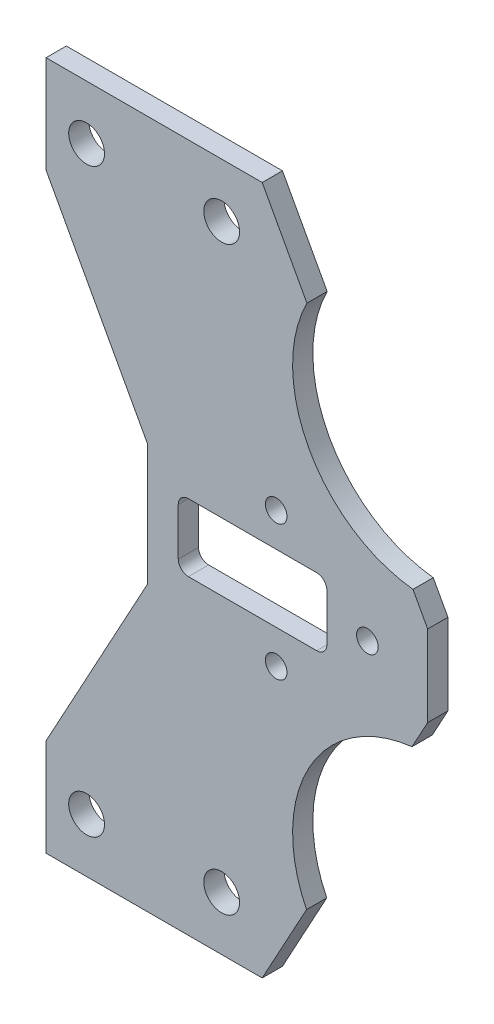
ISO-10303-21;
HEADER;
FILE_DESCRIPTION(('STEP AP214'),'2;1');
FILE_NAME('part.step','',(''),(''),'','','');
FILE_SCHEMA(('AUTOMOTIVE_DESIGN { 1 0 10303 214 1 1 1 1 }'));
ENDSEC;
DATA;
#1=APPLICATION_CONTEXT('core data for automotive mechanical design processes');
#2=APPLICATION_PROTOCOL_DEFINITION('international standard','automotive_design',2000,#1);
#3=PRODUCT_CONTEXT('',#1,'mechanical');
#4=PRODUCT('Part','Part','',(#3));
#5=PRODUCT_RELATED_PRODUCT_CATEGORY('part','',(#4));
#6=PRODUCT_DEFINITION_FORMATION('','',#4);
#7=PRODUCT_DEFINITION_CONTEXT('part definition',#1,'design');
#8=PRODUCT_DEFINITION('design','',#6,#7);
#9=PRODUCT_DEFINITION_SHAPE('','',#8);
#10=(LENGTH_UNIT() NAMED_UNIT(*) SI_UNIT(.MILLI.,.METRE.));
#11=(NAMED_UNIT(*) PLANE_ANGLE_UNIT() SI_UNIT($,.RADIAN.));
#12=(NAMED_UNIT(*) SI_UNIT($,.STERADIAN.) SOLID_ANGLE_UNIT());
#13=UNCERTAINTY_MEASURE_WITH_UNIT(LENGTH_MEASURE(1.E-05),#10,'distance_accuracy_value','');
#14=(GEOMETRIC_REPRESENTATION_CONTEXT(3) GLOBAL_UNCERTAINTY_ASSIGNED_CONTEXT((#13)) GLOBAL_UNIT_ASSIGNED_CONTEXT((#10,
#11,#12)) REPRESENTATION_CONTEXT('',''));
#15=CARTESIAN_POINT('',(0.,0.,0.));
#16=DIRECTION('',(0.,0.,1.));
#17=DIRECTION('',(1.,0.,0.));
#18=AXIS2_PLACEMENT_3D('',#15,#16,#17);
#19=CARTESIAN_POINT('',(-2.00000000001422,-49.7400000000227,3.));
#20=DIRECTION('',(-0.878270215756522,0.478164645404688,0.));
#21=DIRECTION('',(-0.478164645404688,-0.878270215756523,0.));
#22=AXIS2_PLACEMENT_3D('',#19,#20,#21);
#23=PLANE('',#22);
#24=DIRECTION('',(0.478164645404688,0.878270215756523,0.));
#25=VECTOR('',#24,1.);
#26=CARTESIAN_POINT('',(-2.00000000001422,-49.7400000000227,0.));
#27=LINE('',#26,#25);
#28=CARTESIAN_POINT('',(-2.00000000001422,-49.7400000000227,0.));
#29=VERTEX_POINT('',#28);
#30=CARTESIAN_POINT('',(4.55807759293036,-37.6944331061576,0.));
#31=VERTEX_POINT('',#30);
#32=EDGE_CURVE('E227',#29,#31,#27,.T.);
#33=ORIENTED_EDGE('',*,*,#32,.T.);
#34=DIRECTION('',(0.,0.,1.));
#35=VECTOR('',#34,1.);
#36=CARTESIAN_POINT('',(4.55807759293037,-37.6944331061576,0.));
#37=LINE('',#36,#35);
#38=CARTESIAN_POINT('',(4.55807759293036,-37.6944331061576,3.));
#39=VERTEX_POINT('',#38);
#40=EDGE_CURVE('E11',#31,#39,#37,.T.);
#41=ORIENTED_EDGE('',*,*,#40,.T.);
#42=DIRECTION('',(0.478164645404688,0.878270215756523,0.));
#43=VECTOR('',#42,1.);
#44=CARTESIAN_POINT('',(-2.00000000001422,-49.7400000000227,3.));
#45=LINE('',#44,#43);
#46=CARTESIAN_POINT('',(-2.00000000001422,-49.7400000000227,3.));
#47=VERTEX_POINT('',#46);
#48=EDGE_CURVE('E206',#47,#39,#45,.T.);
#49=ORIENTED_EDGE('',*,*,#48,.F.);
#50=DIRECTION('',(0.,0.,-1.));
#51=VECTOR('',#50,1.);
#52=CARTESIAN_POINT('',(-2.00000000001422,-49.7400000000227,3.));
#53=LINE('',#52,#51);
#54=EDGE_CURVE('E244',#47,#29,#53,.T.);
#55=ORIENTED_EDGE('',*,*,#54,.T.);
#56=EDGE_LOOP('',(#33,#41,#49,#55));
#57=FACE_BOUND('',#56,.T.);
#58=ADVANCED_FACE('F33',(#57),#23,.F.);
#59=CARTESIAN_POINT('',(22.5011205762868,7.26249999997726,3.));
#60=DIRECTION('',(-0.87827021575671,-0.478164645404344,0.));
#61=DIRECTION('',(0.478164645404344,-0.87827021575671,0.));
#62=AXIS2_PLACEMENT_3D('',#59,#60,#61);
#63=PLANE('',#62);
#64=DIRECTION('',(-0.478164645404344,0.87827021575671,0.));
#65=VECTOR('',#64,1.);
#66=CARTESIAN_POINT('',(22.5011205762868,7.26249999997726,0.));
#67=LINE('',#66,#65);
#68=CARTESIAN_POINT('',(22.5011205762868,7.26249999997726,0.));
#69=VERTEX_POINT('',#68);
#70=CARTESIAN_POINT('',(20.3254373282089,11.258692136039,0.));
#71=VERTEX_POINT('',#70);
#72=EDGE_CURVE('E233',#69,#71,#67,.T.);
#73=ORIENTED_EDGE('',*,*,#72,.T.);
#74=DIRECTION('',(0.,0.,1.));
#75=VECTOR('',#74,1.);
#76=CARTESIAN_POINT('',(20.3254373282089,11.258692136039,0.));
#77=LINE('',#76,#75);
#78=CARTESIAN_POINT('',(20.3254373282089,11.258692136039,3.));
#79=VERTEX_POINT('',#78);
#80=EDGE_CURVE('E187',#71,#79,#77,.T.);
#81=ORIENTED_EDGE('',*,*,#80,.T.);
#82=DIRECTION('',(-0.478164645404344,0.87827021575671,0.));
#83=VECTOR('',#82,1.);
#84=CARTESIAN_POINT('',(22.5011205762868,7.26249999997726,3.));
#85=LINE('',#84,#83);
#86=CARTESIAN_POINT('',(22.5011205762868,7.26249999997726,3.));
#87=VERTEX_POINT('',#86);
#88=EDGE_CURVE('E198',#87,#79,#85,.T.);
#89=ORIENTED_EDGE('',*,*,#88,.F.);
#90=DIRECTION('',(0.,0.,-1.));
#91=VECTOR('',#90,1.);
#92=CARTESIAN_POINT('',(22.5011205762868,7.26249999997726,3.));
#93=LINE('',#92,#91);
#94=EDGE_CURVE('E238',#87,#69,#93,.T.);
#95=ORIENTED_EDGE('',*,*,#94,.T.);
#96=EDGE_LOOP('',(#73,#81,#89,#95));
#97=FACE_BOUND('',#96,.T.);
#98=ADVANCED_FACE('F282',(#97),#63,.F.);
#99=CARTESIAN_POINT('',(0.,0.,3.));
#100=DIRECTION('',(0.,0.,1.));
#101=DIRECTION('',(1.,0.,0.));
#102=AXIS2_PLACEMENT_3D('',#99,#100,#101);
#103=PLANE('',#102);
#104=CARTESIAN_POINT('',(22.5011205816073,31.1399999999821,3.));
#105=DIRECTION('',(0.,0.,1.));
#106=DIRECTION('',(1.,0.,0.));
#107=AXIS2_PLACEMENT_3D('',#104,#105,#106);
#108=CIRCLE('',#107,20.);
#109=CARTESIAN_POINT('',(4.62172069778161,40.1025364598384,3.));
#110=VERTEX_POINT('',#109);
#111=EDGE_CURVE('E182',#110,#79,#108,.T.);
#112=ORIENTED_EDGE('',*,*,#111,.F.);
#113=CARTESIAN_POINT('',(-1.99999999999215,52.2649999999787,3.));
#114=VERTEX_POINT('',#113);
#115=EDGE_CURVE('E195',#110,#114,#85,.T.);
#116=ORIENTED_EDGE('',*,*,#115,.T.);
#117=DIRECTION('',(-1.,0.,0.));
#118=VECTOR('',#117,1.);
#119=CARTESIAN_POINT('',(-1.99999999999215,52.2649999999787,3.));
#120=LINE('',#119,#118);
#121=CARTESIAN_POINT('',(-33.9999998897314,52.2649999999788,3.));
#122=VERTEX_POINT('',#121);
#123=EDGE_CURVE('E236',#114,#122,#120,.T.);
#124=ORIENTED_EDGE('',*,*,#123,.T.);
#125=DIRECTION('',(0.,-1.,0.));
#126=VECTOR('',#125,1.);
#127=CARTESIAN_POINT('',(-33.9999998897314,52.2649999999788,3.));
#128=LINE('',#127,#126);
#129=CARTESIAN_POINT('',(-33.9999998897314,37.8445419864148,3.));
#130=VERTEX_POINT('',#129);
#131=EDGE_CURVE('E390',#122,#130,#128,.T.);
#132=ORIENTED_EDGE('',*,*,#131,.T.);
#133=DIRECTION('',(0.478164645404344,-0.87827021575671,0.));
#134=VECTOR('',#133,1.);
#135=CARTESIAN_POINT('',(-33.9999998897314,37.8445419864148,3.));
#136=LINE('',#135,#134);
#137=CARTESIAN_POINT('',(-18.9999998897314,10.2932511016393,3.));
#138=VERTEX_POINT('',#137);
#139=EDGE_CURVE('E392',#130,#138,#136,.T.);
#140=ORIENTED_EDGE('',*,*,#139,.T.);
#141=DIRECTION('',(0.,-1.,0.));
#142=VECTOR('',#141,1.);
#143=CARTESIAN_POINT('',(-18.9999998897314,10.2932511016393,3.));
#144=LINE('',#143,#142);
#145=CARTESIAN_POINT('',(-18.9999998897314,-7.76825110166631,3.));
#146=VERTEX_POINT('',#145);
#147=EDGE_CURVE('E394',#138,#146,#144,.T.);
#148=ORIENTED_EDGE('',*,*,#147,.T.);
#149=DIRECTION('',(-0.478164645404688,-0.878270215756523,0.));
#150=VECTOR('',#149,1.);
#151=CARTESIAN_POINT('',(-18.9999998897314,-7.76825110166631,3.));
#152=LINE('',#151,#150);
#153=CARTESIAN_POINT('',(-33.9999998897314,-35.3195419864162,3.));
#154=VERTEX_POINT('',#153);
#155=EDGE_CURVE('E396',#146,#154,#152,.T.);
#156=ORIENTED_EDGE('',*,*,#155,.T.);
#157=DIRECTION('',(-1.53160872389053E-12,-1.,0.));
#158=VECTOR('',#157,1.);
#159=CARTESIAN_POINT('',(-33.9999998897314,-35.3195419864162,3.));
#160=LINE('',#159,#158);
#161=CARTESIAN_POINT('',(-33.9999998897535,-49.7400000000226,3.));
#162=VERTEX_POINT('',#161);
#163=EDGE_CURVE('E398',#154,#162,#160,.T.);
#164=ORIENTED_EDGE('',*,*,#163,.T.);
#165=DIRECTION('',(1.,0.,0.));
#166=VECTOR('',#165,1.);
#167=CARTESIAN_POINT('',(-33.9999998897535,-49.7400000000226,3.));
#168=LINE('',#167,#166);
#169=EDGE_CURVE('E400',#162,#47,#168,.T.);
#170=ORIENTED_EDGE('',*,*,#169,.T.);
#171=ORIENTED_EDGE('',*,*,#48,.T.);
#172=CARTESIAN_POINT('',(22.5011205816028,-28.8600000000295,3.));
#173=DIRECTION('',(0.,0.,1.));
#174=DIRECTION('',(1.,0.,0.));
#175=AXIS2_PLACEMENT_3D('',#172,#173,#174);
#176=CIRCLE('',#175,20.);
#177=CARTESIAN_POINT('',(20.1833011275658,-8.99476119002556,3.));
#178=VERTEX_POINT('',#177);
#179=EDGE_CURVE('E291',#178,#39,#176,.T.);
#180=ORIENTED_EDGE('',*,*,#179,.F.);
#181=CARTESIAN_POINT('',(22.5011205762868,-4.73750000002275,3.));
#182=VERTEX_POINT('',#181);
#183=EDGE_CURVE('E269',#178,#182,#45,.T.);
#184=ORIENTED_EDGE('',*,*,#183,.T.);
#185=DIRECTION('',(0.,1.,0.));
#186=VECTOR('',#185,1.);
#187=CARTESIAN_POINT('',(22.5011205762868,-4.73750000002275,3.));
#188=LINE('',#187,#186);
#189=EDGE_CURVE('E204',#182,#87,#188,.T.);
#190=ORIENTED_EDGE('',*,*,#189,.T.);
#191=ORIENTED_EDGE('',*,*,#88,.T.);
#192=EDGE_LOOP('',(#112,#116,#124,#132,#140,#148,#156,#164,#170,#171,#180,#184,#190,#191));
#193=FACE_BOUND('',#192,.T.);
#194=CARTESIAN_POINT('',(13.5711205815829,1.26249999997724,3.));
#195=DIRECTION('',(0.,0.,1.));
#196=DIRECTION('',(1.,0.,0.));
#197=AXIS2_PLACEMENT_3D('',#194,#195,#196);
#198=CIRCLE('',#197,1.6);
#199=CARTESIAN_POINT('',(15.1711205815829,1.26249999997724,3.));
#200=VERTEX_POINT('',#199);
#201=EDGE_CURVE('E355',#200,#200,#198,.T.);
#202=ORIENTED_EDGE('',*,*,#201,.F.);
#203=EDGE_LOOP('',(#202));
#204=FACE_BOUND('',#203,.T.);
#205=CARTESIAN_POINT('',(-8.00000000001106,-41.7399999999931,3.));
#206=DIRECTION('',(0.,0.,1.));
#207=DIRECTION('',(1.,0.,0.));
#208=AXIS2_PLACEMENT_3D('',#205,#206,#207);
#209=CIRCLE('',#208,2.65);
#210=CARTESIAN_POINT('',(-5.35000000001106,-41.7399999999931,3.));
#211=VERTEX_POINT('',#210);
#212=EDGE_CURVE('E367',#211,#211,#209,.T.);
#213=ORIENTED_EDGE('',*,*,#212,.F.);
#214=EDGE_LOOP('',(#213));
#215=FACE_BOUND('',#214,.T.);
#216=CARTESIAN_POINT('',(-7.99999999998905,44.262899898266,3.));
#217=DIRECTION('',(0.,0.,1.));
#218=DIRECTION('',(1.,0.,0.));
#219=AXIS2_PLACEMENT_3D('',#216,#217,#218);
#220=CIRCLE('',#219,2.65);
#221=CARTESIAN_POINT('',(-5.34999999998905,44.262899898266,3.));
#222=VERTEX_POINT('',#221);
#223=EDGE_CURVE('E379',#222,#222,#220,.T.);
#224=ORIENTED_EDGE('',*,*,#223,.F.);
#225=EDGE_LOOP('',(#224));
#226=FACE_BOUND('',#225,.T.);
#227=CARTESIAN_POINT('',(-27.9999998897284,44.2649999999493,3.));
#228=DIRECTION('',(0.,0.,1.));
#229=DIRECTION('',(1.,0.,0.));
#230=AXIS2_PLACEMENT_3D('',#227,#228,#229);
#231=CIRCLE('',#230,2.65);
#232=CARTESIAN_POINT('',(-25.3499998897284,44.2649999999493,3.));
#233=VERTEX_POINT('',#232);
#234=EDGE_CURVE('E214',#233,#233,#231,.T.);
#235=ORIENTED_EDGE('',*,*,#234,.F.);
#236=EDGE_LOOP('',(#235));
#237=FACE_BOUND('',#236,.T.);
#238=CARTESIAN_POINT('',(-27.9999998897504,-41.7378998983098,3.));
#239=DIRECTION('',(0.,0.,1.));
#240=DIRECTION('',(1.,0.,0.));
#241=AXIS2_PLACEMENT_3D('',#238,#239,#240);
#242=CIRCLE('',#241,2.65);
#243=CARTESIAN_POINT('',(-25.3499998897504,-41.7378998983098,3.));
#244=VERTEX_POINT('',#243);
#245=EDGE_CURVE('E373',#244,#244,#242,.T.);
#246=ORIENTED_EDGE('',*,*,#245,.F.);
#247=EDGE_LOOP('',(#246));
#248=FACE_BOUND('',#247,.T.);
#249=CARTESIAN_POINT('',(0.0711205815834802,11.2624999999772,3.));
#250=DIRECTION('',(0.,0.,1.));
#251=DIRECTION('',(1.,0.,0.));
#252=AXIS2_PLACEMENT_3D('',#249,#250,#251);
#253=CIRCLE('',#252,1.6);
#254=CARTESIAN_POINT('',(1.67112058158348,11.2624999999772,3.));
#255=VERTEX_POINT('',#254);
#256=EDGE_CURVE('E361',#255,#255,#253,.T.);
#257=ORIENTED_EDGE('',*,*,#256,.F.);
#258=EDGE_LOOP('',(#257));
#259=FACE_BOUND('',#258,.T.);
#260=CARTESIAN_POINT('',(0.0711205815835114,-8.73750000002278,3.));
#261=DIRECTION('',(0.,0.,1.));
#262=DIRECTION('',(1.,0.,0.));
#263=AXIS2_PLACEMENT_3D('',#260,#261,#262);
#264=CIRCLE('',#263,1.6);
#265=CARTESIAN_POINT('',(1.67112058158351,-8.73750000002278,3.));
#266=VERTEX_POINT('',#265);
#267=EDGE_CURVE('E349',#266,#266,#264,.T.);
#268=ORIENTED_EDGE('',*,*,#267,.F.);
#269=EDGE_LOOP('',(#268));
#270=FACE_BOUND('',#269,.T.);
#271=DIRECTION('',(0.,-1.,0.));
#272=VECTOR('',#271,1.);
#273=CARTESIAN_POINT('',(-14.4288794184174,4.7624999999772,3.));
#274=LINE('',#273,#272);
#275=CARTESIAN_POINT('',(-14.4288794184174,4.7624999999772,3.));
#276=VERTEX_POINT('',#275);
#277=CARTESIAN_POINT('',(-14.4288794184176,-2.2375000000228,3.));
#278=VERTEX_POINT('',#277);
#279=EDGE_CURVE('E295',#276,#278,#274,.T.);
#280=ORIENTED_EDGE('',*,*,#279,.F.);
#281=CARTESIAN_POINT('',(-12.9288794184174,4.7624999999772,3.));
#282=DIRECTION('',(0.,0.,1.));
#283=DIRECTION('',(1.,0.,0.));
#284=AXIS2_PLACEMENT_3D('',#281,#282,#283);
#285=CIRCLE('',#284,1.5);
#286=CARTESIAN_POINT('',(-12.9288794184174,6.2624999999772,3.));
#287=VERTEX_POINT('',#286);
#288=EDGE_CURVE('E293',#287,#276,#285,.T.);
#289=ORIENTED_EDGE('',*,*,#288,.F.);
#290=DIRECTION('',(-1.,0.,0.));
#291=VECTOR('',#290,1.);
#292=CARTESIAN_POINT('',(6.07112058158241,6.26249999997723,3.));
#293=LINE('',#292,#291);
#294=CARTESIAN_POINT('',(6.07112058158241,6.26249999997723,3.));
#295=VERTEX_POINT('',#294);
#296=EDGE_CURVE('E309',#295,#287,#293,.T.);
#297=ORIENTED_EDGE('',*,*,#296,.F.);
#298=CARTESIAN_POINT('',(6.07112058158242,4.76249999997723,3.));
#299=DIRECTION('',(0.,0.,1.));
#300=DIRECTION('',(1.,0.,0.));
#301=AXIS2_PLACEMENT_3D('',#298,#299,#300);
#302=CIRCLE('',#301,1.5);
#303=CARTESIAN_POINT('',(7.57112058158242,4.76249999997723,3.));
#304=VERTEX_POINT('',#303);
#305=EDGE_CURVE('E306',#304,#295,#302,.T.);
#306=ORIENTED_EDGE('',*,*,#305,.F.);
#307=DIRECTION('',(0.,1.,0.));
#308=VECTOR('',#307,1.);
#309=CARTESIAN_POINT('',(7.57112058158243,-2.23750000002276,3.));
#310=LINE('',#309,#308);
#311=CARTESIAN_POINT('',(7.57112058158243,-2.23750000002276,3.));
#312=VERTEX_POINT('',#311);
#313=EDGE_CURVE('E304',#312,#304,#310,.T.);
#314=ORIENTED_EDGE('',*,*,#313,.F.);
#315=CARTESIAN_POINT('',(6.07112058158243,-2.23750000002277,3.));
#316=DIRECTION('',(0.,0.,1.));
#317=DIRECTION('',(1.,0.,0.));
#318=AXIS2_PLACEMENT_3D('',#315,#316,#317);
#319=CIRCLE('',#318,1.5);
#320=CARTESIAN_POINT('',(6.07112058158243,-3.73750000002277,3.));
#321=VERTEX_POINT('',#320);
#322=EDGE_CURVE('E302',#321,#312,#319,.T.);
#323=ORIENTED_EDGE('',*,*,#322,.F.);
#324=DIRECTION('',(1.,0.,0.));
#325=VECTOR('',#324,1.);
#326=CARTESIAN_POINT('',(-12.9288794184176,-3.7375000000228,3.));
#327=LINE('',#326,#325);
#328=CARTESIAN_POINT('',(-12.9288794184176,-3.7375000000228,3.));
#329=VERTEX_POINT('',#328);
#330=EDGE_CURVE('E300',#329,#321,#327,.T.);
#331=ORIENTED_EDGE('',*,*,#330,.F.);
#332=CARTESIAN_POINT('',(-12.9288794184176,-2.2375000000228,3.));
#333=DIRECTION('',(0.,0.,1.));
#334=DIRECTION('',(1.,0.,0.));
#335=AXIS2_PLACEMENT_3D('',#332,#333,#334);
#336=CIRCLE('',#335,1.5);
#337=EDGE_CURVE('E298',#278,#329,#336,.T.);
#338=ORIENTED_EDGE('',*,*,#337,.F.);
#339=EDGE_LOOP('',(#280,#289,#297,#306,#314,#323,#331,#338));
#340=FACE_BOUND('',#339,.T.);
#341=ADVANCED_FACE('F192',(#193,#204,#215,#226,#237,#248,#259,#270,#340),#103,.T.);
#342=CARTESIAN_POINT('',(0.,0.,0.));
#343=DIRECTION('',(0.,0.,1.));
#344=DIRECTION('',(1.,0.,0.));
#345=AXIS2_PLACEMENT_3D('',#342,#343,#344);
#346=PLANE('',#345);
#347=CARTESIAN_POINT('',(0.0711205815835114,-8.73750000002278,0.));
#348=DIRECTION('',(0.,0.,1.));
#349=DIRECTION('',(1.,0.,0.));
#350=AXIS2_PLACEMENT_3D('',#347,#348,#349);
#351=CIRCLE('',#350,1.6);
#352=CARTESIAN_POINT('',(1.67112058158351,-8.73750000002278,0.));
#353=VERTEX_POINT('',#352);
#354=EDGE_CURVE('E348',#353,#353,#351,.T.);
#355=ORIENTED_EDGE('',*,*,#354,.T.);
#356=EDGE_LOOP('',(#355));
#357=FACE_BOUND('',#356,.T.);
#358=CARTESIAN_POINT('',(13.5711205815829,1.26249999997724,0.));
#359=DIRECTION('',(0.,0.,1.));
#360=DIRECTION('',(1.,0.,0.));
#361=AXIS2_PLACEMENT_3D('',#358,#359,#360);
#362=CIRCLE('',#361,1.6);
#363=CARTESIAN_POINT('',(15.1711205815829,1.26249999997724,0.));
#364=VERTEX_POINT('',#363);
#365=EDGE_CURVE('E352',#364,#364,#362,.T.);
#366=ORIENTED_EDGE('',*,*,#365,.T.);
#367=EDGE_LOOP('',(#366));
#368=FACE_BOUND('',#367,.T.);
#369=CARTESIAN_POINT('',(0.0711205815834802,11.2624999999772,0.));
#370=DIRECTION('',(0.,0.,1.));
#371=DIRECTION('',(1.,0.,0.));
#372=AXIS2_PLACEMENT_3D('',#369,#370,#371);
#373=CIRCLE('',#372,1.6);
#374=CARTESIAN_POINT('',(1.67112058158348,11.2624999999772,0.));
#375=VERTEX_POINT('',#374);
#376=EDGE_CURVE('E358',#375,#375,#373,.T.);
#377=ORIENTED_EDGE('',*,*,#376,.T.);
#378=EDGE_LOOP('',(#377));
#379=FACE_BOUND('',#378,.T.);
#380=CARTESIAN_POINT('',(-8.00000000001106,-41.7399999999931,0.));
#381=DIRECTION('',(0.,0.,1.));
#382=DIRECTION('',(1.,0.,0.));
#383=AXIS2_PLACEMENT_3D('',#380,#381,#382);
#384=CIRCLE('',#383,2.65);
#385=CARTESIAN_POINT('',(-5.35000000001106,-41.7399999999931,0.));
#386=VERTEX_POINT('',#385);
#387=EDGE_CURVE('E364',#386,#386,#384,.T.);
#388=ORIENTED_EDGE('',*,*,#387,.T.);
#389=EDGE_LOOP('',(#388));
#390=FACE_BOUND('',#389,.T.);
#391=CARTESIAN_POINT('',(-27.9999998897504,-41.7378998983098,0.));
#392=DIRECTION('',(0.,0.,1.));
#393=DIRECTION('',(1.,0.,0.));
#394=AXIS2_PLACEMENT_3D('',#391,#392,#393);
#395=CIRCLE('',#394,2.65);
#396=CARTESIAN_POINT('',(-25.3499998897504,-41.7378998983098,0.));
#397=VERTEX_POINT('',#396);
#398=EDGE_CURVE('E370',#397,#397,#395,.T.);
#399=ORIENTED_EDGE('',*,*,#398,.T.);
#400=EDGE_LOOP('',(#399));
#401=FACE_BOUND('',#400,.T.);
#402=CARTESIAN_POINT('',(-7.99999999998905,44.262899898266,0.));
#403=DIRECTION('',(0.,0.,1.));
#404=DIRECTION('',(1.,0.,0.));
#405=AXIS2_PLACEMENT_3D('',#402,#403,#404);
#406=CIRCLE('',#405,2.65);
#407=CARTESIAN_POINT('',(-5.34999999998905,44.262899898266,0.));
#408=VERTEX_POINT('',#407);
#409=EDGE_CURVE('E376',#408,#408,#406,.T.);
#410=ORIENTED_EDGE('',*,*,#409,.T.);
#411=EDGE_LOOP('',(#410));
#412=FACE_BOUND('',#411,.T.);
#413=CARTESIAN_POINT('',(-27.9999998897284,44.2649999999493,0.));
#414=DIRECTION('',(0.,0.,1.));
#415=DIRECTION('',(1.,0.,0.));
#416=AXIS2_PLACEMENT_3D('',#413,#414,#415);
#417=CIRCLE('',#416,2.65);
#418=CARTESIAN_POINT('',(-25.3499998897284,44.2649999999493,0.));
#419=VERTEX_POINT('',#418);
#420=EDGE_CURVE('E382',#419,#419,#417,.T.);
#421=ORIENTED_EDGE('',*,*,#420,.T.);
#422=EDGE_LOOP('',(#421));
#423=FACE_BOUND('',#422,.T.);
#424=CARTESIAN_POINT('',(4.6217206977816,40.1025364598384,0.));
#425=VERTEX_POINT('',#424);
#426=CARTESIAN_POINT('',(-1.99999999999215,52.2649999999787,0.));
#427=VERTEX_POINT('',#426);
#428=EDGE_CURVE('E232',#425,#427,#67,.T.);
#429=ORIENTED_EDGE('',*,*,#428,.F.);
#430=CARTESIAN_POINT('',(22.5011205816073,31.1399999999821,0.));
#431=DIRECTION('',(0.,0.,1.));
#432=DIRECTION('',(1.,0.,0.));
#433=AXIS2_PLACEMENT_3D('',#430,#431,#432);
#434=CIRCLE('',#433,20.);
#435=EDGE_CURVE('E56',#425,#71,#434,.T.);
#436=ORIENTED_EDGE('',*,*,#435,.T.);
#437=ORIENTED_EDGE('',*,*,#72,.F.);
#438=DIRECTION('',(0.,1.,0.));
#439=VECTOR('',#438,1.);
#440=CARTESIAN_POINT('',(22.5011205762868,-4.73750000002275,0.));
#441=LINE('',#440,#439);
#442=CARTESIAN_POINT('',(22.5011205762868,-4.73750000002275,0.));
#443=VERTEX_POINT('',#442);
#444=EDGE_CURVE('E230',#443,#69,#441,.T.);
#445=ORIENTED_EDGE('',*,*,#444,.F.);
#446=CARTESIAN_POINT('',(20.1833011275658,-8.99476119002556,0.));
#447=VERTEX_POINT('',#446);
#448=EDGE_CURVE('E226',#447,#443,#27,.T.);
#449=ORIENTED_EDGE('',*,*,#448,.F.);
#450=CARTESIAN_POINT('',(22.5011205816028,-28.8600000000295,0.));
#451=DIRECTION('',(0.,0.,1.));
#452=DIRECTION('',(1.,0.,0.));
#453=AXIS2_PLACEMENT_3D('',#450,#451,#452);
#454=CIRCLE('',#453,20.);
#455=EDGE_CURVE('E48',#447,#31,#454,.T.);
#456=ORIENTED_EDGE('',*,*,#455,.T.);
#457=ORIENTED_EDGE('',*,*,#32,.F.);
#458=DIRECTION('',(1.,0.,0.));
#459=VECTOR('',#458,1.);
#460=CARTESIAN_POINT('',(-33.9999998897535,-49.7400000000226,0.));
#461=LINE('',#460,#459);
#462=CARTESIAN_POINT('',(-33.9999998897535,-49.7400000000226,0.));
#463=VERTEX_POINT('',#462);
#464=EDGE_CURVE('E224',#463,#29,#461,.T.);
#465=ORIENTED_EDGE('',*,*,#464,.F.);
#466=DIRECTION('',(-1.53160872389053E-12,-1.,0.));
#467=VECTOR('',#466,1.);
#468=CARTESIAN_POINT('',(-33.9999998897314,-35.3195419864162,0.));
#469=LINE('',#468,#467);
#470=CARTESIAN_POINT('',(-33.9999998897314,-35.3195419864162,0.));
#471=VERTEX_POINT('',#470);
#472=EDGE_CURVE('E222',#471,#463,#469,.T.);
#473=ORIENTED_EDGE('',*,*,#472,.F.);
#474=DIRECTION('',(-0.478164645404688,-0.878270215756523,0.));
#475=VECTOR('',#474,1.);
#476=CARTESIAN_POINT('',(-18.9999998897314,-7.76825110166631,0.));
#477=LINE('',#476,#475);
#478=CARTESIAN_POINT('',(-18.9999998897314,-7.76825110166631,0.));
#479=VERTEX_POINT('',#478);
#480=EDGE_CURVE('E220',#479,#471,#477,.T.);
#481=ORIENTED_EDGE('',*,*,#480,.F.);
#482=DIRECTION('',(0.,-1.,0.));
#483=VECTOR('',#482,1.);
#484=CARTESIAN_POINT('',(-18.9999998897314,10.2932511016393,0.));
#485=LINE('',#484,#483);
#486=CARTESIAN_POINT('',(-18.9999998897314,10.2932511016393,0.));
#487=VERTEX_POINT('',#486);
#488=EDGE_CURVE('E218',#487,#479,#485,.T.);
#489=ORIENTED_EDGE('',*,*,#488,.F.);
#490=DIRECTION('',(0.478164645404344,-0.87827021575671,0.));
#491=VECTOR('',#490,1.);
#492=CARTESIAN_POINT('',(-33.9999998897314,37.8445419864148,0.));
#493=LINE('',#492,#491);
#494=CARTESIAN_POINT('',(-33.9999998897314,37.8445419864148,0.));
#495=VERTEX_POINT('',#494);
#496=EDGE_CURVE('E216',#495,#487,#493,.T.);
#497=ORIENTED_EDGE('',*,*,#496,.F.);
#498=DIRECTION('',(0.,-1.,0.));
#499=VECTOR('',#498,1.);
#500=CARTESIAN_POINT('',(-33.9999998897314,52.2649999999788,0.));
#501=LINE('',#500,#499);
#502=CARTESIAN_POINT('',(-33.9999998897314,52.2649999999788,0.));
#503=VERTEX_POINT('',#502);
#504=EDGE_CURVE('E213',#503,#495,#501,.T.);
#505=ORIENTED_EDGE('',*,*,#504,.F.);
#506=DIRECTION('',(-1.,0.,0.));
#507=VECTOR('',#506,1.);
#508=CARTESIAN_POINT('',(-1.99999999999215,52.2649999999787,0.));
#509=LINE('',#508,#507);
#510=EDGE_CURVE('E210',#427,#503,#509,.T.);
#511=ORIENTED_EDGE('',*,*,#510,.F.);
#512=EDGE_LOOP('',(#429,#436,#437,#445,#449,#456,#457,#465,#473,#481,#489,#497,#505,#511));
#513=FACE_BOUND('',#512,.T.);
#514=CARTESIAN_POINT('',(-12.9288794184174,4.7624999999772,0.));
#515=DIRECTION('',(0.,0.,1.));
#516=DIRECTION('',(1.,0.,0.));
#517=AXIS2_PLACEMENT_3D('',#514,#515,#516);
#518=CIRCLE('',#517,1.5);
#519=CARTESIAN_POINT('',(-12.9288794184174,6.2624999999772,0.));
#520=VERTEX_POINT('',#519);
#521=CARTESIAN_POINT('',(-14.4288794184174,4.7624999999772,0.));
#522=VERTEX_POINT('',#521);
#523=EDGE_CURVE('E284',#520,#522,#518,.T.);
#524=ORIENTED_EDGE('',*,*,#523,.T.);
#525=DIRECTION('',(0.,-1.,0.));
#526=VECTOR('',#525,1.);
#527=CARTESIAN_POINT('',(-14.4288794184174,4.7624999999772,0.));
#528=LINE('',#527,#526);
#529=CARTESIAN_POINT('',(-14.4288794184176,-2.2375000000228,0.));
#530=VERTEX_POINT('',#529);
#531=EDGE_CURVE('E287',#522,#530,#528,.T.);
#532=ORIENTED_EDGE('',*,*,#531,.T.);
#533=CARTESIAN_POINT('',(-12.9288794184176,-2.2375000000228,0.));
#534=DIRECTION('',(0.,0.,1.));
#535=DIRECTION('',(1.,0.,0.));
#536=AXIS2_PLACEMENT_3D('',#533,#534,#535);
#537=CIRCLE('',#536,1.5);
#538=CARTESIAN_POINT('',(-12.9288794184176,-3.7375000000228,0.));
#539=VERTEX_POINT('',#538);
#540=EDGE_CURVE('E314',#530,#539,#537,.T.);
#541=ORIENTED_EDGE('',*,*,#540,.T.);
#542=DIRECTION('',(1.,0.,0.));
#543=VECTOR('',#542,1.);
#544=CARTESIAN_POINT('',(-12.9288794184176,-3.7375000000228,0.));
#545=LINE('',#544,#543);
#546=CARTESIAN_POINT('',(6.07112058158243,-3.73750000002277,0.));
#547=VERTEX_POINT('',#546);
#548=EDGE_CURVE('E317',#539,#547,#545,.T.);
#549=ORIENTED_EDGE('',*,*,#548,.T.);
#550=CARTESIAN_POINT('',(6.07112058158243,-2.23750000002277,0.));
#551=DIRECTION('',(0.,0.,1.));
#552=DIRECTION('',(1.,0.,0.));
#553=AXIS2_PLACEMENT_3D('',#550,#551,#552);
#554=CIRCLE('',#553,1.5);
#555=CARTESIAN_POINT('',(7.57112058158243,-2.23750000002276,0.));
#556=VERTEX_POINT('',#555);
#557=EDGE_CURVE('E320',#547,#556,#554,.T.);
#558=ORIENTED_EDGE('',*,*,#557,.T.);
#559=DIRECTION('',(0.,1.,0.));
#560=VECTOR('',#559,1.);
#561=CARTESIAN_POINT('',(7.57112058158243,-2.23750000002276,0.));
#562=LINE('',#561,#560);
#563=CARTESIAN_POINT('',(7.57112058158242,4.76249999997723,0.));
#564=VERTEX_POINT('',#563);
#565=EDGE_CURVE('E323',#556,#564,#562,.T.);
#566=ORIENTED_EDGE('',*,*,#565,.T.);
#567=CARTESIAN_POINT('',(6.07112058158242,4.76249999997723,0.));
#568=DIRECTION('',(0.,0.,1.));
#569=DIRECTION('',(1.,0.,0.));
#570=AXIS2_PLACEMENT_3D('',#567,#568,#569);
#571=CIRCLE('',#570,1.5);
#572=CARTESIAN_POINT('',(6.07112058158241,6.26249999997723,0.));
#573=VERTEX_POINT('',#572);
#574=EDGE_CURVE('E326',#564,#573,#571,.T.);
#575=ORIENTED_EDGE('',*,*,#574,.T.);
#576=DIRECTION('',(-1.,0.,0.));
#577=VECTOR('',#576,1.);
#578=CARTESIAN_POINT('',(6.07112058158241,6.26249999997723,0.));
#579=LINE('',#578,#577);
#580=EDGE_CURVE('E296',#573,#520,#579,.T.);
#581=ORIENTED_EDGE('',*,*,#580,.T.);
#582=EDGE_LOOP('',(#524,#532,#541,#549,#558,#566,#575,#581));
#583=FACE_BOUND('',#582,.T.);
#584=ADVANCED_FACE('F273',(#357,#368,#379,#390,#401,#412,#423,#513,#583),#346,.F.);
#585=CARTESIAN_POINT('',(-1.99999999999215,52.2649999999787,3.));
#586=DIRECTION('',(0.,-1.,0.));
#587=DIRECTION('',(1.,0.,0.));
#588=AXIS2_PLACEMENT_3D('',#585,#586,#587);
#589=PLANE('',#588);
#590=ORIENTED_EDGE('',*,*,#510,.T.);
#591=DIRECTION('',(0.,0.,-1.));
#592=VECTOR('',#591,1.);
#593=CARTESIAN_POINT('',(-33.9999998897314,52.2649999999788,3.));
#594=LINE('',#593,#592);
#595=EDGE_CURVE('E188',#122,#503,#594,.T.);
#596=ORIENTED_EDGE('',*,*,#595,.F.);
#597=ORIENTED_EDGE('',*,*,#123,.F.);
#598=DIRECTION('',(0.,0.,-1.));
#599=VECTOR('',#598,1.);
#600=CARTESIAN_POINT('',(-1.99999999999215,52.2649999999787,3.));
#601=LINE('',#600,#599);
#602=EDGE_CURVE('E202',#114,#427,#601,.T.);
#603=ORIENTED_EDGE('',*,*,#602,.T.);
#604=EDGE_LOOP('',(#590,#596,#597,#603));
#605=FACE_BOUND('',#604,.T.);
#606=ADVANCED_FACE('F35',(#605),#589,.F.);
#607=CARTESIAN_POINT('',(-33.9999998897314,52.2649999999788,3.));
#608=DIRECTION('',(1.,0.,0.));
#609=DIRECTION('',(0.,0.,-1.));
#610=AXIS2_PLACEMENT_3D('',#607,#608,#609);
#611=PLANE('',#610);
#612=ORIENTED_EDGE('',*,*,#504,.T.);
#613=DIRECTION('',(0.,0.,-1.));
#614=VECTOR('',#613,1.);
#615=CARTESIAN_POINT('',(-33.9999998897314,37.8445419864148,3.));
#616=LINE('',#615,#614);
#617=EDGE_CURVE('E259',#130,#495,#616,.T.);
#618=ORIENTED_EDGE('',*,*,#617,.F.);
#619=ORIENTED_EDGE('',*,*,#131,.F.);
#620=ORIENTED_EDGE('',*,*,#595,.T.);
#621=EDGE_LOOP('',(#612,#618,#619,#620));
#622=FACE_BOUND('',#621,.T.);
#623=ADVANCED_FACE('F432',(#622),#611,.F.);
#624=CARTESIAN_POINT('',(-33.9999998897314,37.8445419864148,3.));
#625=DIRECTION('',(0.87827021575671,0.478164645404344,0.));
#626=DIRECTION('',(-0.478164645404344,0.87827021575671,0.));
#627=AXIS2_PLACEMENT_3D('',#624,#625,#626);
#628=PLANE('',#627);
#629=ORIENTED_EDGE('',*,*,#496,.T.);
#630=DIRECTION('',(0.,0.,-1.));
#631=VECTOR('',#630,1.);
#632=CARTESIAN_POINT('',(-18.9999998897314,10.2932511016393,3.));
#633=LINE('',#632,#631);
#634=EDGE_CURVE('E256',#138,#487,#633,.T.);
#635=ORIENTED_EDGE('',*,*,#634,.F.);
#636=ORIENTED_EDGE('',*,*,#139,.F.);
#637=ORIENTED_EDGE('',*,*,#617,.T.);
#638=EDGE_LOOP('',(#629,#635,#636,#637));
#639=FACE_BOUND('',#638,.T.);
#640=ADVANCED_FACE('F429',(#639),#628,.F.);
#641=CARTESIAN_POINT('',(-18.9999998897314,10.2932511016393,3.));
#642=DIRECTION('',(1.,0.,0.));
#643=DIRECTION('',(0.,1.,0.));
#644=AXIS2_PLACEMENT_3D('',#641,#642,#643);
#645=PLANE('',#644);
#646=ORIENTED_EDGE('',*,*,#488,.T.);
#647=DIRECTION('',(0.,0.,-1.));
#648=VECTOR('',#647,1.);
#649=CARTESIAN_POINT('',(-18.9999998897314,-7.76825110166631,3.));
#650=LINE('',#649,#648);
#651=EDGE_CURVE('E253',#146,#479,#650,.T.);
#652=ORIENTED_EDGE('',*,*,#651,.F.);
#653=ORIENTED_EDGE('',*,*,#147,.F.);
#654=ORIENTED_EDGE('',*,*,#634,.T.);
#655=EDGE_LOOP('',(#646,#652,#653,#654));
#656=FACE_BOUND('',#655,.T.);
#657=ADVANCED_FACE('F424',(#656),#645,.F.);
#658=CARTESIAN_POINT('',(-18.9999998897314,-7.76825110166631,3.));
#659=DIRECTION('',(0.878270215756523,-0.478164645404688,0.));
#660=DIRECTION('',(0.478164645404688,0.878270215756523,0.));
#661=AXIS2_PLACEMENT_3D('',#658,#659,#660);
#662=PLANE('',#661);
#663=ORIENTED_EDGE('',*,*,#480,.T.);
#664=DIRECTION('',(0.,0.,-1.));
#665=VECTOR('',#664,1.);
#666=CARTESIAN_POINT('',(-33.9999998897314,-35.3195419864162,3.));
#667=LINE('',#666,#665);
#668=EDGE_CURVE('E250',#154,#471,#667,.T.);
#669=ORIENTED_EDGE('',*,*,#668,.F.);
#670=ORIENTED_EDGE('',*,*,#155,.F.);
#671=ORIENTED_EDGE('',*,*,#651,.T.);
#672=EDGE_LOOP('',(#663,#669,#670,#671));
#673=FACE_BOUND('',#672,.T.);
#674=ADVANCED_FACE('F419',(#673),#662,.F.);
#675=CARTESIAN_POINT('',(-33.9999998897314,-35.3195419864162,3.));
#676=DIRECTION('',(1.,-1.53160872389053E-12,0.));
#677=DIRECTION('',(1.53160872389053E-12,1.,0.));
#678=AXIS2_PLACEMENT_3D('',#675,#676,#677);
#679=PLANE('',#678);
#680=ORIENTED_EDGE('',*,*,#472,.T.);
#681=DIRECTION('',(0.,0.,-1.));
#682=VECTOR('',#681,1.);
#683=CARTESIAN_POINT('',(-33.9999998897535,-49.7400000000226,3.));
#684=LINE('',#683,#682);
#685=EDGE_CURVE('E247',#162,#463,#684,.T.);
#686=ORIENTED_EDGE('',*,*,#685,.F.);
#687=ORIENTED_EDGE('',*,*,#163,.F.);
#688=ORIENTED_EDGE('',*,*,#668,.T.);
#689=EDGE_LOOP('',(#680,#686,#687,#688));
#690=FACE_BOUND('',#689,.T.);
#691=ADVANCED_FACE('F415',(#690),#679,.F.);
#692=CARTESIAN_POINT('',(-33.9999998897535,-49.7400000000226,3.));
#693=DIRECTION('',(0.,1.,0.));
#694=DIRECTION('',(-1.,0.,0.));
#695=AXIS2_PLACEMENT_3D('',#692,#693,#694);
#696=PLANE('',#695);
#697=ORIENTED_EDGE('',*,*,#464,.T.);
#698=ORIENTED_EDGE('',*,*,#54,.F.);
#699=ORIENTED_EDGE('',*,*,#169,.F.);
#700=ORIENTED_EDGE('',*,*,#685,.T.);
#701=EDGE_LOOP('',(#697,#698,#699,#700));
#702=FACE_BOUND('',#701,.T.);
#703=ADVANCED_FACE('F410',(#702),#696,.F.);
#704=ORIENTED_EDGE('',*,*,#183,.F.);
#705=DIRECTION('',(0.,0.,1.));
#706=VECTOR('',#705,1.);
#707=CARTESIAN_POINT('',(20.1833011275658,-8.99476119002556,0.));
#708=LINE('',#707,#706);
#709=EDGE_CURVE('E41',#178,#447,#708,.F.);
#710=ORIENTED_EDGE('',*,*,#709,.T.);
#711=ORIENTED_EDGE('',*,*,#448,.T.);
#712=DIRECTION('',(0.,0.,-1.));
#713=VECTOR('',#712,1.);
#714=CARTESIAN_POINT('',(22.5011205762868,-4.73750000002275,3.));
#715=LINE('',#714,#713);
#716=EDGE_CURVE('E241',#182,#443,#715,.T.);
#717=ORIENTED_EDGE('',*,*,#716,.F.);
#718=EDGE_LOOP('',(#704,#710,#711,#717));
#719=FACE_BOUND('',#718,.T.);
#720=ADVANCED_FACE('F267',(#719),#23,.F.);
#721=CARTESIAN_POINT('',(22.5011205762868,-4.73750000002275,3.));
#722=DIRECTION('',(-1.,0.,0.));
#723=DIRECTION('',(0.,0.,1.));
#724=AXIS2_PLACEMENT_3D('',#721,#722,#723);
#725=PLANE('',#724);
#726=ORIENTED_EDGE('',*,*,#444,.T.);
#727=ORIENTED_EDGE('',*,*,#94,.F.);
#728=ORIENTED_EDGE('',*,*,#189,.F.);
#729=ORIENTED_EDGE('',*,*,#716,.T.);
#730=EDGE_LOOP('',(#726,#727,#728,#729));
#731=FACE_BOUND('',#730,.T.);
#732=ADVANCED_FACE('F279',(#731),#725,.F.);
#733=ORIENTED_EDGE('',*,*,#115,.F.);
#734=DIRECTION('',(0.,0.,1.));
#735=VECTOR('',#734,1.);
#736=CARTESIAN_POINT('',(4.62172069778161,40.1025364598384,0.));
#737=LINE('',#736,#735);
#738=EDGE_CURVE('E179',#110,#425,#737,.F.);
#739=ORIENTED_EDGE('',*,*,#738,.T.);
#740=ORIENTED_EDGE('',*,*,#428,.T.);
#741=ORIENTED_EDGE('',*,*,#602,.F.);
#742=EDGE_LOOP('',(#733,#739,#740,#741));
#743=FACE_BOUND('',#742,.T.);
#744=ADVANCED_FACE('F200',(#743),#63,.F.);
#745=CARTESIAN_POINT('',(-27.9999998897284,44.2649999999493,3.));
#746=DIRECTION('',(0.,0.,-1.));
#747=DIRECTION('',(-1.,0.,0.));
#748=AXIS2_PLACEMENT_3D('',#745,#746,#747);
#749=CYLINDRICAL_SURFACE('',#748,2.65);
#750=ORIENTED_EDGE('',*,*,#234,.T.);
#751=EDGE_LOOP('',(#750));
#752=FACE_BOUND('',#751,.T.);
#753=ORIENTED_EDGE('',*,*,#420,.F.);
#754=EDGE_LOOP('',(#753));
#755=FACE_BOUND('',#754,.T.);
#756=ADVANCED_FACE('F499',(#752,#755),#749,.F.);
#757=CARTESIAN_POINT('',(-7.99999999998905,44.262899898266,3.));
#758=DIRECTION('',(0.,0.,-1.));
#759=DIRECTION('',(-1.,0.,0.));
#760=AXIS2_PLACEMENT_3D('',#757,#758,#759);
#761=CYLINDRICAL_SURFACE('',#760,2.65);
#762=ORIENTED_EDGE('',*,*,#223,.T.);
#763=EDGE_LOOP('',(#762));
#764=FACE_BOUND('',#763,.T.);
#765=ORIENTED_EDGE('',*,*,#409,.F.);
#766=EDGE_LOOP('',(#765));
#767=FACE_BOUND('',#766,.T.);
#768=ADVANCED_FACE('F504',(#764,#767),#761,.F.);
#769=CARTESIAN_POINT('',(-27.9999998897504,-41.7378998983098,3.));
#770=DIRECTION('',(0.,0.,-1.));
#771=DIRECTION('',(-1.,0.,0.));
#772=AXIS2_PLACEMENT_3D('',#769,#770,#771);
#773=CYLINDRICAL_SURFACE('',#772,2.65);
#774=ORIENTED_EDGE('',*,*,#245,.T.);
#775=EDGE_LOOP('',(#774));
#776=FACE_BOUND('',#775,.T.);
#777=ORIENTED_EDGE('',*,*,#398,.F.);
#778=EDGE_LOOP('',(#777));
#779=FACE_BOUND('',#778,.T.);
#780=ADVANCED_FACE('F514',(#776,#779),#773,.F.);
#781=CARTESIAN_POINT('',(-8.00000000001106,-41.7399999999931,3.));
#782=DIRECTION('',(0.,0.,-1.));
#783=DIRECTION('',(-1.,0.,0.));
#784=AXIS2_PLACEMENT_3D('',#781,#782,#783);
#785=CYLINDRICAL_SURFACE('',#784,2.65);
#786=ORIENTED_EDGE('',*,*,#212,.T.);
#787=EDGE_LOOP('',(#786));
#788=FACE_BOUND('',#787,.T.);
#789=ORIENTED_EDGE('',*,*,#387,.F.);
#790=EDGE_LOOP('',(#789));
#791=FACE_BOUND('',#790,.T.);
#792=ADVANCED_FACE('F524',(#788,#791),#785,.F.);
#793=CARTESIAN_POINT('',(0.0711205815834802,11.2624999999772,3.));
#794=DIRECTION('',(0.,0.,-1.));
#795=DIRECTION('',(-1.,0.,0.));
#796=AXIS2_PLACEMENT_3D('',#793,#794,#795);
#797=CYLINDRICAL_SURFACE('',#796,1.6);
#798=ORIENTED_EDGE('',*,*,#256,.T.);
#799=EDGE_LOOP('',(#798));
#800=FACE_BOUND('',#799,.T.);
#801=ORIENTED_EDGE('',*,*,#376,.F.);
#802=EDGE_LOOP('',(#801));
#803=FACE_BOUND('',#802,.T.);
#804=ADVANCED_FACE('F534',(#800,#803),#797,.F.);
#805=CARTESIAN_POINT('',(13.5711205815829,1.26249999997724,3.));
#806=DIRECTION('',(0.,0.,-1.));
#807=DIRECTION('',(-1.,0.,0.));
#808=AXIS2_PLACEMENT_3D('',#805,#806,#807);
#809=CYLINDRICAL_SURFACE('',#808,1.6);
#810=ORIENTED_EDGE('',*,*,#201,.T.);
#811=EDGE_LOOP('',(#810));
#812=FACE_BOUND('',#811,.T.);
#813=ORIENTED_EDGE('',*,*,#365,.F.);
#814=EDGE_LOOP('',(#813));
#815=FACE_BOUND('',#814,.T.);
#816=ADVANCED_FACE('F544',(#812,#815),#809,.F.);
#817=CARTESIAN_POINT('',(0.0711205815835114,-8.73750000002278,3.));
#818=DIRECTION('',(0.,0.,-1.));
#819=DIRECTION('',(-1.,0.,0.));
#820=AXIS2_PLACEMENT_3D('',#817,#818,#819);
#821=CYLINDRICAL_SURFACE('',#820,1.6);
#822=ORIENTED_EDGE('',*,*,#267,.T.);
#823=EDGE_LOOP('',(#822));
#824=FACE_BOUND('',#823,.T.);
#825=ORIENTED_EDGE('',*,*,#354,.F.);
#826=EDGE_LOOP('',(#825));
#827=FACE_BOUND('',#826,.T.);
#828=ADVANCED_FACE('F554',(#824,#827),#821,.F.);
#829=CARTESIAN_POINT('',(-12.9288794184174,4.7624999999772,3.));
#830=DIRECTION('',(0.,0.,-1.));
#831=DIRECTION('',(-1.,0.,0.));
#832=AXIS2_PLACEMENT_3D('',#829,#830,#831);
#833=CYLINDRICAL_SURFACE('',#832,1.5);
#834=ORIENTED_EDGE('',*,*,#523,.F.);
#835=DIRECTION('',(0.,0.,-1.));
#836=VECTOR('',#835,1.);
#837=CARTESIAN_POINT('',(-12.9288794184174,6.2624999999772,3.));
#838=LINE('',#837,#836);
#839=EDGE_CURVE('E310',#287,#520,#838,.T.);
#840=ORIENTED_EDGE('',*,*,#839,.F.);
#841=ORIENTED_EDGE('',*,*,#288,.T.);
#842=DIRECTION('',(0.,0.,-1.));
#843=VECTOR('',#842,1.);
#844=CARTESIAN_POINT('',(-14.4288794184174,4.7624999999772,3.));
#845=LINE('',#844,#843);
#846=EDGE_CURVE('E345',#276,#522,#845,.T.);
#847=ORIENTED_EDGE('',*,*,#846,.T.);
#848=EDGE_LOOP('',(#834,#840,#841,#847));
#849=FACE_BOUND('',#848,.T.);
#850=ADVANCED_FACE('F564',(#849),#833,.F.);
#851=CARTESIAN_POINT('',(-14.4288794184174,4.7624999999772,3.));
#852=DIRECTION('',(1.,0.,0.));
#853=DIRECTION('',(0.,1.,0.));
#854=AXIS2_PLACEMENT_3D('',#851,#852,#853);
#855=PLANE('',#854);
#856=ORIENTED_EDGE('',*,*,#531,.F.);
#857=ORIENTED_EDGE('',*,*,#846,.F.);
#858=ORIENTED_EDGE('',*,*,#279,.T.);
#859=DIRECTION('',(0.,0.,-1.));
#860=VECTOR('',#859,1.);
#861=CARTESIAN_POINT('',(-14.4288794184176,-2.2375000000228,3.));
#862=LINE('',#861,#860);
#863=EDGE_CURVE('E343',#278,#530,#862,.T.);
#864=ORIENTED_EDGE('',*,*,#863,.T.);
#865=EDGE_LOOP('',(#856,#857,#858,#864));
#866=FACE_BOUND('',#865,.T.);
#867=ADVANCED_FACE('F574',(#866),#855,.T.);
#868=CARTESIAN_POINT('',(-12.9288794184176,-2.2375000000228,3.));
#869=DIRECTION('',(0.,0.,-1.));
#870=DIRECTION('',(-1.,0.,0.));
#871=AXIS2_PLACEMENT_3D('',#868,#869,#870);
#872=CYLINDRICAL_SURFACE('',#871,1.5);
#873=ORIENTED_EDGE('',*,*,#540,.F.);
#874=ORIENTED_EDGE('',*,*,#863,.F.);
#875=ORIENTED_EDGE('',*,*,#337,.T.);
#876=DIRECTION('',(0.,0.,-1.));
#877=VECTOR('',#876,1.);
#878=CARTESIAN_POINT('',(-12.9288794184176,-3.7375000000228,3.));
#879=LINE('',#878,#877);
#880=EDGE_CURVE('E341',#329,#539,#879,.T.);
#881=ORIENTED_EDGE('',*,*,#880,.T.);
#882=EDGE_LOOP('',(#873,#874,#875,#881));
#883=FACE_BOUND('',#882,.T.);
#884=ADVANCED_FACE('F584',(#883),#872,.F.);
#885=CARTESIAN_POINT('',(-12.9288794184176,-3.7375000000228,3.));
#886=DIRECTION('',(0.,1.,0.));
#887=DIRECTION('',(-1.,0.,0.));
#888=AXIS2_PLACEMENT_3D('',#885,#886,#887);
#889=PLANE('',#888);
#890=ORIENTED_EDGE('',*,*,#548,.F.);
#891=ORIENTED_EDGE('',*,*,#880,.F.);
#892=ORIENTED_EDGE('',*,*,#330,.T.);
#893=DIRECTION('',(0.,0.,-1.));
#894=VECTOR('',#893,1.);
#895=CARTESIAN_POINT('',(6.07112058158243,-3.73750000002277,3.));
#896=LINE('',#895,#894);
#897=EDGE_CURVE('E339',#321,#547,#896,.T.);
#898=ORIENTED_EDGE('',*,*,#897,.T.);
#899=EDGE_LOOP('',(#890,#891,#892,#898));
#900=FACE_BOUND('',#899,.T.);
#901=ADVANCED_FACE('F594',(#900),#889,.T.);
#902=CARTESIAN_POINT('',(6.07112058158243,-2.23750000002277,3.));
#903=DIRECTION('',(0.,0.,-1.));
#904=DIRECTION('',(-1.,0.,0.));
#905=AXIS2_PLACEMENT_3D('',#902,#903,#904);
#906=CYLINDRICAL_SURFACE('',#905,1.5);
#907=ORIENTED_EDGE('',*,*,#557,.F.);
#908=ORIENTED_EDGE('',*,*,#897,.F.);
#909=ORIENTED_EDGE('',*,*,#322,.T.);
#910=DIRECTION('',(0.,0.,-1.));
#911=VECTOR('',#910,1.);
#912=CARTESIAN_POINT('',(7.57112058158243,-2.23750000002276,3.));
#913=LINE('',#912,#911);
#914=EDGE_CURVE('E337',#312,#556,#913,.T.);
#915=ORIENTED_EDGE('',*,*,#914,.T.);
#916=EDGE_LOOP('',(#907,#908,#909,#915));
#917=FACE_BOUND('',#916,.T.);
#918=ADVANCED_FACE('F604',(#917),#906,.F.);
#919=CARTESIAN_POINT('',(7.57112058158243,-2.23750000002276,3.));
#920=DIRECTION('',(-1.,0.,0.));
#921=DIRECTION('',(0.,-1.,0.));
#922=AXIS2_PLACEMENT_3D('',#919,#920,#921);
#923=PLANE('',#922);
#924=ORIENTED_EDGE('',*,*,#565,.F.);
#925=ORIENTED_EDGE('',*,*,#914,.F.);
#926=ORIENTED_EDGE('',*,*,#313,.T.);
#927=DIRECTION('',(0.,0.,-1.));
#928=VECTOR('',#927,1.);
#929=CARTESIAN_POINT('',(7.57112058158242,4.76249999997723,3.));
#930=LINE('',#929,#928);
#931=EDGE_CURVE('E335',#304,#564,#930,.T.);
#932=ORIENTED_EDGE('',*,*,#931,.T.);
#933=EDGE_LOOP('',(#924,#925,#926,#932));
#934=FACE_BOUND('',#933,.T.);
#935=ADVANCED_FACE('F614',(#934),#923,.T.);
#936=CARTESIAN_POINT('',(6.07112058158242,4.76249999997723,3.));
#937=DIRECTION('',(0.,0.,-1.));
#938=DIRECTION('',(-1.,0.,0.));
#939=AXIS2_PLACEMENT_3D('',#936,#937,#938);
#940=CYLINDRICAL_SURFACE('',#939,1.5);
#941=ORIENTED_EDGE('',*,*,#574,.F.);
#942=ORIENTED_EDGE('',*,*,#931,.F.);
#943=ORIENTED_EDGE('',*,*,#305,.T.);
#944=DIRECTION('',(0.,0.,-1.));
#945=VECTOR('',#944,1.);
#946=CARTESIAN_POINT('',(6.07112058158241,6.26249999997723,3.));
#947=LINE('',#946,#945);
#948=EDGE_CURVE('E333',#295,#573,#947,.T.);
#949=ORIENTED_EDGE('',*,*,#948,.T.);
#950=EDGE_LOOP('',(#941,#942,#943,#949));
#951=FACE_BOUND('',#950,.T.);
#952=ADVANCED_FACE('F624',(#951),#940,.F.);
#953=CARTESIAN_POINT('',(6.07112058158241,6.26249999997723,3.));
#954=DIRECTION('',(0.,-1.,0.));
#955=DIRECTION('',(1.,0.,0.));
#956=AXIS2_PLACEMENT_3D('',#953,#954,#955);
#957=PLANE('',#956);
#958=ORIENTED_EDGE('',*,*,#580,.F.);
#959=ORIENTED_EDGE('',*,*,#948,.F.);
#960=ORIENTED_EDGE('',*,*,#296,.T.);
#961=ORIENTED_EDGE('',*,*,#839,.T.);
#962=EDGE_LOOP('',(#958,#959,#960,#961));
#963=FACE_BOUND('',#962,.T.);
#964=ADVANCED_FACE('F634',(#963),#957,.T.);
#965=CARTESIAN_POINT('',(22.5011205816073,31.1399999999821,0.));
#966=DIRECTION('',(0.,0.,1.));
#967=DIRECTION('',(1.,0.,0.));
#968=AXIS2_PLACEMENT_3D('',#965,#966,#967);
#969=CYLINDRICAL_SURFACE('',#968,20.);
#970=ORIENTED_EDGE('',*,*,#435,.F.);
#971=ORIENTED_EDGE('',*,*,#738,.F.);
#972=ORIENTED_EDGE('',*,*,#111,.T.);
#973=ORIENTED_EDGE('',*,*,#80,.F.);
#974=EDGE_LOOP('',(#970,#971,#972,#973));
#975=FACE_BOUND('',#974,.T.);
#976=ADVANCED_FACE('F181',(#975),#969,.F.);
#977=CARTESIAN_POINT('',(22.5011205816028,-28.8600000000295,0.));
#978=DIRECTION('',(0.,0.,1.));
#979=DIRECTION('',(1.,0.,0.));
#980=AXIS2_PLACEMENT_3D('',#977,#978,#979);
#981=CYLINDRICAL_SURFACE('',#980,20.);
#982=ORIENTED_EDGE('',*,*,#455,.F.);
#983=ORIENTED_EDGE('',*,*,#709,.F.);
#984=ORIENTED_EDGE('',*,*,#179,.T.);
#985=ORIENTED_EDGE('',*,*,#40,.F.);
#986=EDGE_LOOP('',(#982,#983,#984,#985));
#987=FACE_BOUND('',#986,.T.);
#988=ADVANCED_FACE('F403',(#987),#981,.F.);
#989=CLOSED_SHELL('',(#58,#98,#341,#584,#606,#623,#640,#657,#674,#691,#703,#720,#732,#744,#756,
#768,#780,#792,#804,#816,#828,#850,#867,#884,#901,#918,#935,#952,#964,#976,#988));
#990=MANIFOLD_SOLID_BREP('B2',#989);
#991=ADVANCED_BREP_SHAPE_REPRESENTATION('',(#18,#990),#14);
#992=SHAPE_DEFINITION_REPRESENTATION(#9,#991);
ENDSEC;
END-ISO-10303-21;
